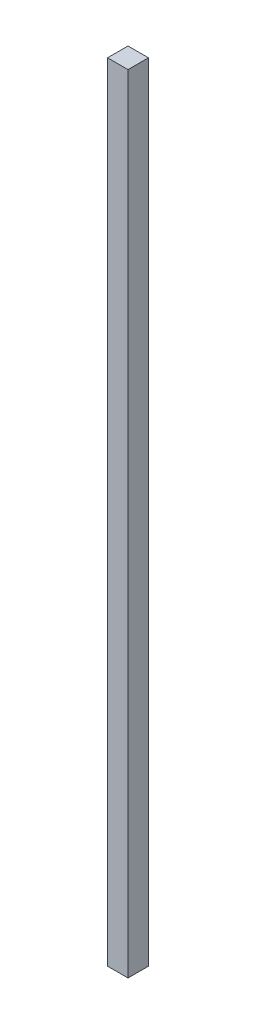
ISO-10303-21;
HEADER;
FILE_DESCRIPTION(('STEP AP214'),'2;1');
FILE_NAME('part.step','',(''),(''),'','','');
FILE_SCHEMA(('AUTOMOTIVE_DESIGN { 1 0 10303 214 1 1 1 1 }'));
ENDSEC;
DATA;
#1=APPLICATION_CONTEXT('core data for automotive mechanical design processes');
#2=APPLICATION_PROTOCOL_DEFINITION('international standard','automotive_design',2000,#1);
#3=PRODUCT_CONTEXT('',#1,'mechanical');
#4=PRODUCT('Part','Part','',(#3));
#5=PRODUCT_RELATED_PRODUCT_CATEGORY('part','',(#4));
#6=PRODUCT_DEFINITION_FORMATION('','',#4);
#7=PRODUCT_DEFINITION_CONTEXT('part definition',#1,'design');
#8=PRODUCT_DEFINITION('design','',#6,#7);
#9=PRODUCT_DEFINITION_SHAPE('','',#8);
#10=(LENGTH_UNIT() NAMED_UNIT(*) SI_UNIT(.MILLI.,.METRE.));
#11=(NAMED_UNIT(*) PLANE_ANGLE_UNIT() SI_UNIT($,.RADIAN.));
#12=(NAMED_UNIT(*) SI_UNIT($,.STERADIAN.) SOLID_ANGLE_UNIT());
#13=UNCERTAINTY_MEASURE_WITH_UNIT(LENGTH_MEASURE(1.E-05),#10,'distance_accuracy_value','');
#14=(GEOMETRIC_REPRESENTATION_CONTEXT(3) GLOBAL_UNCERTAINTY_ASSIGNED_CONTEXT((#13)) GLOBAL_UNIT_ASSIGNED_CONTEXT((#10,
#11,#12)) REPRESENTATION_CONTEXT('',''));
#15=CARTESIAN_POINT('',(0.,0.,0.));
#16=DIRECTION('',(0.,0.,1.));
#17=DIRECTION('',(1.,0.,0.));
#18=AXIS2_PLACEMENT_3D('',#15,#16,#17);
#19=CARTESIAN_POINT('',(0.,244.348,0.));
#20=DIRECTION('',(1.,0.,0.));
#21=DIRECTION('',(0.,0.,-1.));
#22=AXIS2_PLACEMENT_3D('',#19,#20,#21);
#23=PLANE('',#22);
#24=DIRECTION('',(0.,0.,1.));
#25=VECTOR('',#24,1.);
#26=CARTESIAN_POINT('',(0.,0.,0.));
#27=LINE('',#26,#25);
#28=CARTESIAN_POINT('',(0.,0.,0.));
#29=VERTEX_POINT('',#28);
#30=CARTESIAN_POINT('',(0.,0.,6.35));
#31=VERTEX_POINT('',#30);
#32=EDGE_CURVE('E107',#29,#31,#27,.T.);
#33=ORIENTED_EDGE('',*,*,#32,.T.);
#34=DIRECTION('',(0.,-1.,0.));
#35=VECTOR('',#34,1.);
#36=CARTESIAN_POINT('',(0.,244.348,6.35));
#37=LINE('',#36,#35);
#38=CARTESIAN_POINT('',(0.,244.348,6.35));
#39=VERTEX_POINT('',#38);
#40=EDGE_CURVE('E11',#39,#31,#37,.T.);
#41=ORIENTED_EDGE('',*,*,#40,.F.);
#42=DIRECTION('',(0.,0.,1.));
#43=VECTOR('',#42,1.);
#44=CARTESIAN_POINT('',(0.,244.348,0.));
#45=LINE('',#44,#43);
#46=CARTESIAN_POINT('',(0.,244.348,0.));
#47=VERTEX_POINT('',#46);
#48=EDGE_CURVE('E91',#47,#39,#45,.T.);
#49=ORIENTED_EDGE('',*,*,#48,.F.);
#50=DIRECTION('',(0.,-1.,0.));
#51=VECTOR('',#50,1.);
#52=CARTESIAN_POINT('',(0.,244.348,0.));
#53=LINE('',#52,#51);
#54=EDGE_CURVE('E103',#47,#29,#53,.T.);
#55=ORIENTED_EDGE('',*,*,#54,.T.);
#56=EDGE_LOOP('',(#33,#41,#49,#55));
#57=FACE_BOUND('',#56,.T.);
#58=ADVANCED_FACE('F39',(#57),#23,.F.);
#59=CARTESIAN_POINT('',(0.,244.348,6.35));
#60=DIRECTION('',(0.,0.,-1.));
#61=DIRECTION('',(-1.,0.,0.));
#62=AXIS2_PLACEMENT_3D('',#59,#60,#61);
#63=PLANE('',#62);
#64=DIRECTION('',(1.,0.,0.));
#65=VECTOR('',#64,1.);
#66=CARTESIAN_POINT('',(0.,0.,6.35));
#67=LINE('',#66,#65);
#68=CARTESIAN_POINT('',(6.35,0.,6.35));
#69=VERTEX_POINT('',#68);
#70=EDGE_CURVE('E96',#31,#69,#67,.T.);
#71=ORIENTED_EDGE('',*,*,#70,.T.);
#72=DIRECTION('',(0.,-1.,0.));
#73=VECTOR('',#72,1.);
#74=CARTESIAN_POINT('',(6.35,244.348,6.35));
#75=LINE('',#74,#73);
#76=CARTESIAN_POINT('',(6.35,244.348,6.35));
#77=VERTEX_POINT('',#76);
#78=EDGE_CURVE('E48',#77,#69,#75,.T.);
#79=ORIENTED_EDGE('',*,*,#78,.F.);
#80=DIRECTION('',(1.,0.,0.));
#81=VECTOR('',#80,1.);
#82=CARTESIAN_POINT('',(0.,244.348,6.35));
#83=LINE('',#82,#81);
#84=EDGE_CURVE('E86',#39,#77,#83,.T.);
#85=ORIENTED_EDGE('',*,*,#84,.F.);
#86=ORIENTED_EDGE('',*,*,#40,.T.);
#87=EDGE_LOOP('',(#71,#79,#85,#86));
#88=FACE_BOUND('',#87,.T.);
#89=ADVANCED_FACE('F95',(#88),#63,.F.);
#90=CARTESIAN_POINT('',(6.35,244.348,0.));
#91=DIRECTION('',(-1.,0.,0.));
#92=DIRECTION('',(0.,0.,1.));
#93=AXIS2_PLACEMENT_3D('',#90,#91,#92);
#94=PLANE('',#93);
#95=DIRECTION('',(0.,0.,-1.));
#96=VECTOR('',#95,1.);
#97=CARTESIAN_POINT('',(6.35,0.,0.));
#98=LINE('',#97,#96);
#99=CARTESIAN_POINT('',(6.35,0.,0.));
#100=VERTEX_POINT('',#99);
#101=EDGE_CURVE('E73',#69,#100,#98,.T.);
#102=ORIENTED_EDGE('',*,*,#101,.T.);
#103=DIRECTION('',(0.,-1.,0.));
#104=VECTOR('',#103,1.);
#105=CARTESIAN_POINT('',(6.35,244.348,0.));
#106=LINE('',#105,#104);
#107=CARTESIAN_POINT('',(6.35,244.348,0.));
#108=VERTEX_POINT('',#107);
#109=EDGE_CURVE('E98',#108,#100,#106,.T.);
#110=ORIENTED_EDGE('',*,*,#109,.F.);
#111=DIRECTION('',(0.,0.,-1.));
#112=VECTOR('',#111,1.);
#113=CARTESIAN_POINT('',(6.35,244.348,0.));
#114=LINE('',#113,#112);
#115=EDGE_CURVE('E89',#77,#108,#114,.T.);
#116=ORIENTED_EDGE('',*,*,#115,.F.);
#117=ORIENTED_EDGE('',*,*,#78,.T.);
#118=EDGE_LOOP('',(#102,#110,#116,#117));
#119=FACE_BOUND('',#118,.T.);
#120=ADVANCED_FACE('F99',(#119),#94,.F.);
#121=CARTESIAN_POINT('',(0.,244.348,0.));
#122=DIRECTION('',(0.,0.,1.));
#123=DIRECTION('',(1.,0.,0.));
#124=AXIS2_PLACEMENT_3D('',#121,#122,#123);
#125=PLANE('',#124);
#126=DIRECTION('',(-1.,0.,0.));
#127=VECTOR('',#126,1.);
#128=CARTESIAN_POINT('',(0.,0.,0.));
#129=LINE('',#128,#127);
#130=EDGE_CURVE('E79',#100,#29,#129,.T.);
#131=ORIENTED_EDGE('',*,*,#130,.T.);
#132=ORIENTED_EDGE('',*,*,#54,.F.);
#133=DIRECTION('',(-1.,0.,0.));
#134=VECTOR('',#133,1.);
#135=CARTESIAN_POINT('',(0.,244.348,0.));
#136=LINE('',#135,#134);
#137=EDGE_CURVE('E56',#108,#47,#136,.T.);
#138=ORIENTED_EDGE('',*,*,#137,.F.);
#139=ORIENTED_EDGE('',*,*,#109,.T.);
#140=EDGE_LOOP('',(#131,#132,#138,#139));
#141=FACE_BOUND('',#140,.T.);
#142=ADVANCED_FACE('F120',(#141),#125,.F.);
#143=CARTESIAN_POINT('',(0.,244.348,0.));
#144=DIRECTION('',(0.,1.,0.));
#145=DIRECTION('',(0.,0.,1.));
#146=AXIS2_PLACEMENT_3D('',#143,#144,#145);
#147=PLANE('',#146);
#148=ORIENTED_EDGE('',*,*,#48,.T.);
#149=ORIENTED_EDGE('',*,*,#84,.T.);
#150=ORIENTED_EDGE('',*,*,#115,.T.);
#151=ORIENTED_EDGE('',*,*,#137,.T.);
#152=EDGE_LOOP('',(#148,#149,#150,#151));
#153=FACE_BOUND('',#152,.T.);
#154=ADVANCED_FACE('F87',(#153),#147,.T.);
#155=CARTESIAN_POINT('',(0.,0.,0.));
#156=DIRECTION('',(0.,1.,0.));
#157=DIRECTION('',(0.,0.,1.));
#158=AXIS2_PLACEMENT_3D('',#155,#156,#157);
#159=PLANE('',#158);
#160=ORIENTED_EDGE('',*,*,#32,.F.);
#161=ORIENTED_EDGE('',*,*,#130,.F.);
#162=ORIENTED_EDGE('',*,*,#101,.F.);
#163=ORIENTED_EDGE('',*,*,#70,.F.);
#164=EDGE_LOOP('',(#160,#161,#162,#163));
#165=FACE_BOUND('',#164,.T.);
#166=ADVANCED_FACE('F123',(#165),#159,.F.);
#167=CLOSED_SHELL('',(#58,#89,#120,#142,#154,#166));
#168=MANIFOLD_SOLID_BREP('B2',#167);
#169=ADVANCED_BREP_SHAPE_REPRESENTATION('',(#18,#168),#14);
#170=SHAPE_DEFINITION_REPRESENTATION(#9,#169);
ENDSEC;
END-ISO-10303-21;
